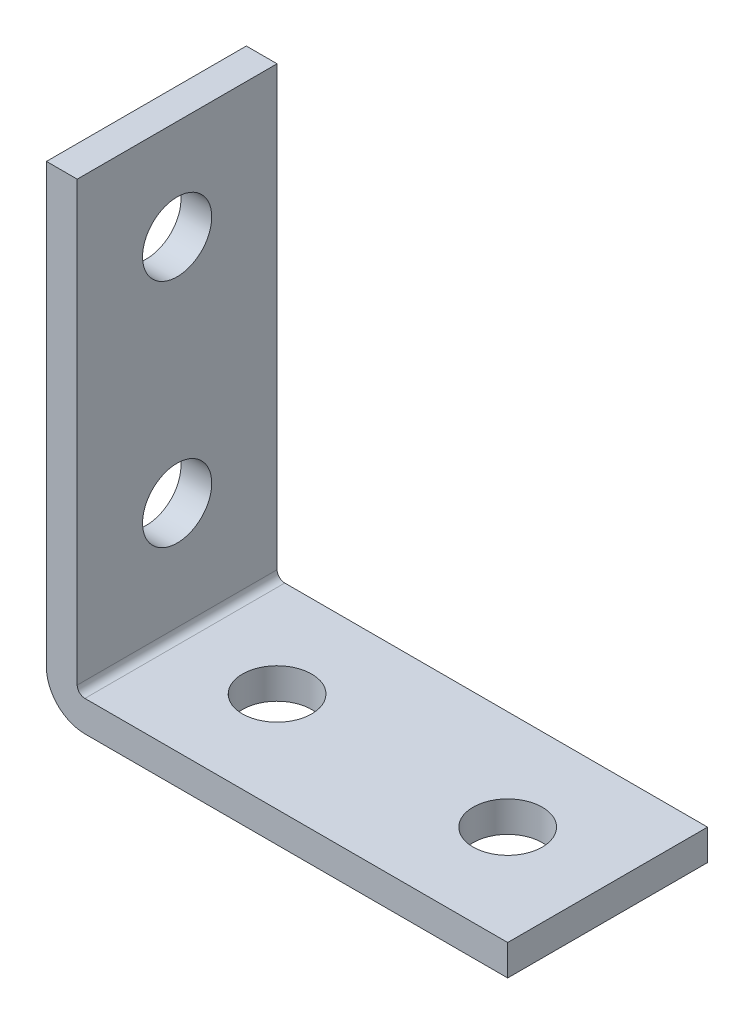
ISO-10303-21;
HEADER;
FILE_DESCRIPTION(('STEP AP214'),'2;1');
FILE_NAME('part.step','',(''),(''),'','','');
FILE_SCHEMA(('AUTOMOTIVE_DESIGN { 1 0 10303 214 1 1 1 1 }'));
ENDSEC;
DATA;
#1=APPLICATION_CONTEXT('core data for automotive mechanical design processes');
#2=APPLICATION_PROTOCOL_DEFINITION('international standard','automotive_design',2000,#1);
#3=PRODUCT_CONTEXT('',#1,'mechanical');
#4=PRODUCT('Part','Part','',(#3));
#5=PRODUCT_RELATED_PRODUCT_CATEGORY('part','',(#4));
#6=PRODUCT_DEFINITION_FORMATION('','',#4);
#7=PRODUCT_DEFINITION_CONTEXT('part definition',#1,'design');
#8=PRODUCT_DEFINITION('design','',#6,#7);
#9=PRODUCT_DEFINITION_SHAPE('','',#8);
#10=(LENGTH_UNIT() NAMED_UNIT(*) SI_UNIT(.MILLI.,.METRE.));
#11=(NAMED_UNIT(*) PLANE_ANGLE_UNIT() SI_UNIT($,.RADIAN.));
#12=(NAMED_UNIT(*) SI_UNIT($,.STERADIAN.) SOLID_ANGLE_UNIT());
#13=UNCERTAINTY_MEASURE_WITH_UNIT(LENGTH_MEASURE(1.E-05),#10,'distance_accuracy_value','');
#14=(GEOMETRIC_REPRESENTATION_CONTEXT(3) GLOBAL_UNCERTAINTY_ASSIGNED_CONTEXT((#13)) GLOBAL_UNIT_ASSIGNED_CONTEXT((#10,
#11,#12)) REPRESENTATION_CONTEXT('',''));
#15=CARTESIAN_POINT('',(0.,0.,0.));
#16=DIRECTION('',(0.,0.,1.));
#17=DIRECTION('',(1.,0.,0.));
#18=AXIS2_PLACEMENT_3D('',#15,#16,#17);
#19=CARTESIAN_POINT('',(7.93750000000001,0.,20.6375));
#20=DIRECTION('',(0.,1.,0.));
#21=DIRECTION('',(0.,0.,1.));
#22=AXIS2_PLACEMENT_3D('',#19,#20,#21);
#23=PLANE('',#22);
#24=CARTESIAN_POINT('',(26.9875,0.,0.));
#25=DIRECTION('',(0.,1.,0.));
#26=DIRECTION('',(0.,0.,1.));
#27=AXIS2_PLACEMENT_3D('',#24,#25,#26);
#28=CIRCLE('',#27,7.14375);
#29=CARTESIAN_POINT('',(26.9875,0.,7.14375));
#30=VERTEX_POINT('',#29);
#31=EDGE_CURVE('E180',#30,#30,#28,.T.);
#32=ORIENTED_EDGE('',*,*,#31,.T.);
#33=EDGE_LOOP('',(#32));
#34=FACE_BOUND('',#33,.T.);
#35=CARTESIAN_POINT('',(74.6125,0.,0.));
#36=DIRECTION('',(0.,1.,0.));
#37=DIRECTION('',(0.,0.,1.));
#38=AXIS2_PLACEMENT_3D('',#35,#36,#37);
#39=CIRCLE('',#38,7.14375);
#40=CARTESIAN_POINT('',(74.6125,0.,7.14375));
#41=VERTEX_POINT('',#40);
#42=EDGE_CURVE('E133',#41,#41,#39,.T.);
#43=ORIENTED_EDGE('',*,*,#42,.T.);
#44=EDGE_LOOP('',(#43));
#45=FACE_BOUND('',#44,.T.);
#46=DIRECTION('',(1.,0.,0.));
#47=VECTOR('',#46,1.);
#48=CARTESIAN_POINT('',(7.93750000000001,0.,-20.6375));
#49=LINE('',#48,#47);
#50=CARTESIAN_POINT('',(7.93750000000001,0.,-20.6375));
#51=VERTEX_POINT('',#50);
#52=CARTESIAN_POINT('',(95.25,0.,-20.6375));
#53=VERTEX_POINT('',#52);
#54=EDGE_CURVE('E129',#51,#53,#49,.T.);
#55=ORIENTED_EDGE('',*,*,#54,.T.);
#56=DIRECTION('',(0.,0.,-1.));
#57=VECTOR('',#56,1.);
#58=CARTESIAN_POINT('',(95.25,0.,20.6375));
#59=LINE('',#58,#57);
#60=CARTESIAN_POINT('',(95.25,0.,20.6375));
#61=VERTEX_POINT('',#60);
#62=EDGE_CURVE('E11',#61,#53,#59,.T.);
#63=ORIENTED_EDGE('',*,*,#62,.F.);
#64=DIRECTION('',(1.,0.,0.));
#65=VECTOR('',#64,1.);
#66=CARTESIAN_POINT('',(7.93750000000001,0.,20.6375));
#67=LINE('',#66,#65);
#68=CARTESIAN_POINT('',(7.93750000000001,0.,20.6375));
#69=VERTEX_POINT('',#68);
#70=EDGE_CURVE('E87',#69,#61,#67,.T.);
#71=ORIENTED_EDGE('',*,*,#70,.F.);
#72=DIRECTION('',(0.,0.,-1.));
#73=VECTOR('',#72,1.);
#74=CARTESIAN_POINT('',(7.93750000000001,0.,20.6375));
#75=LINE('',#74,#73);
#76=EDGE_CURVE('E128',#69,#51,#75,.T.);
#77=ORIENTED_EDGE('',*,*,#76,.T.);
#78=EDGE_LOOP('',(#55,#63,#71,#77));
#79=FACE_BOUND('',#78,.T.);
#80=ADVANCED_FACE('F32',(#34,#45,#79),#23,.F.);
#81=CARTESIAN_POINT('',(95.25,6.35,20.6375));
#82=DIRECTION('',(1.,0.,0.));
#83=DIRECTION('',(0.,0.,-1.));
#84=AXIS2_PLACEMENT_3D('',#81,#82,#83);
#85=PLANE('',#84);
#86=DIRECTION('',(0.,-1.,0.));
#87=VECTOR('',#86,1.);
#88=CARTESIAN_POINT('',(95.25,6.35,-20.6375));
#89=LINE('',#88,#87);
#90=CARTESIAN_POINT('',(95.25,6.35,-20.6375));
#91=VERTEX_POINT('',#90);
#92=EDGE_CURVE('E132',#91,#53,#89,.T.);
#93=ORIENTED_EDGE('',*,*,#92,.F.);
#94=DIRECTION('',(0.,0.,-1.));
#95=VECTOR('',#94,1.);
#96=CARTESIAN_POINT('',(95.25,6.35,20.6375));
#97=LINE('',#96,#95);
#98=CARTESIAN_POINT('',(95.25,6.35,20.6375));
#99=VERTEX_POINT('',#98);
#100=EDGE_CURVE('E40',#99,#91,#97,.T.);
#101=ORIENTED_EDGE('',*,*,#100,.F.);
#102=DIRECTION('',(0.,-1.,0.));
#103=VECTOR('',#102,1.);
#104=CARTESIAN_POINT('',(95.25,6.35,20.6375));
#105=LINE('',#104,#103);
#106=EDGE_CURVE('E172',#99,#61,#105,.T.);
#107=ORIENTED_EDGE('',*,*,#106,.T.);
#108=ORIENTED_EDGE('',*,*,#62,.T.);
#109=EDGE_LOOP('',(#93,#101,#107,#108));
#110=FACE_BOUND('',#109,.T.);
#111=ADVANCED_FACE('F163',(#110),#85,.T.);
#112=CARTESIAN_POINT('',(7.93750000000001,6.35,20.6375));
#113=DIRECTION('',(0.,1.,0.));
#114=DIRECTION('',(0.,0.,1.));
#115=AXIS2_PLACEMENT_3D('',#112,#113,#114);
#116=PLANE('',#115);
#117=CARTESIAN_POINT('',(26.9875,6.35,0.));
#118=DIRECTION('',(0.,1.,0.));
#119=DIRECTION('',(0.,0.,1.));
#120=AXIS2_PLACEMENT_3D('',#117,#118,#119);
#121=CIRCLE('',#120,7.14375);
#122=CARTESIAN_POINT('',(26.9875,6.35,7.14375));
#123=VERTEX_POINT('',#122);
#124=EDGE_CURVE('E183',#123,#123,#121,.T.);
#125=ORIENTED_EDGE('',*,*,#124,.F.);
#126=EDGE_LOOP('',(#125));
#127=FACE_BOUND('',#126,.T.);
#128=CARTESIAN_POINT('',(74.6125,6.35,0.));
#129=DIRECTION('',(0.,1.,0.));
#130=DIRECTION('',(0.,0.,1.));
#131=AXIS2_PLACEMENT_3D('',#128,#129,#130);
#132=CIRCLE('',#131,7.14375);
#133=CARTESIAN_POINT('',(74.6125,6.35,7.14375));
#134=VERTEX_POINT('',#133);
#135=EDGE_CURVE('E177',#134,#134,#132,.T.);
#136=ORIENTED_EDGE('',*,*,#135,.F.);
#137=EDGE_LOOP('',(#136));
#138=FACE_BOUND('',#137,.T.);
#139=DIRECTION('',(1.,0.,0.));
#140=VECTOR('',#139,1.);
#141=CARTESIAN_POINT('',(7.93750000000001,6.35,-20.6375));
#142=LINE('',#141,#140);
#143=CARTESIAN_POINT('',(7.93750000000001,6.35,-20.6375));
#144=VERTEX_POINT('',#143);
#145=EDGE_CURVE('E136',#144,#91,#142,.T.);
#146=ORIENTED_EDGE('',*,*,#145,.F.);
#147=DIRECTION('',(0.,0.,-1.));
#148=VECTOR('',#147,1.);
#149=CARTESIAN_POINT('',(7.93750000000001,6.35,20.6375));
#150=LINE('',#149,#148);
#151=CARTESIAN_POINT('',(7.93750000000001,6.35,20.6375));
#152=VERTEX_POINT('',#151);
#153=EDGE_CURVE('E153',#152,#144,#150,.T.);
#154=ORIENTED_EDGE('',*,*,#153,.F.);
#155=DIRECTION('',(1.,0.,0.));
#156=VECTOR('',#155,1.);
#157=CARTESIAN_POINT('',(7.93750000000001,6.35,20.6375));
#158=LINE('',#157,#156);
#159=EDGE_CURVE('E160',#152,#99,#158,.T.);
#160=ORIENTED_EDGE('',*,*,#159,.T.);
#161=ORIENTED_EDGE('',*,*,#100,.T.);
#162=EDGE_LOOP('',(#146,#154,#160,#161));
#163=FACE_BOUND('',#162,.T.);
#164=ADVANCED_FACE('F158',(#127,#138,#163),#116,.T.);
#165=CARTESIAN_POINT('',(7.93750000000001,7.9375,20.6375));
#166=DIRECTION('',(0.,0.,-1.));
#167=DIRECTION('',(-1.,0.,0.));
#168=AXIS2_PLACEMENT_3D('',#165,#166,#167);
#169=CYLINDRICAL_SURFACE('',#168,1.5875);
#170=CARTESIAN_POINT('',(7.93750000000001,7.9375,-20.6375));
#171=DIRECTION('',(0.,0.,1.));
#172=DIRECTION('',(1.,0.,0.));
#173=AXIS2_PLACEMENT_3D('',#170,#171,#172);
#174=CIRCLE('',#173,1.5875);
#175=CARTESIAN_POINT('',(6.35000000000001,7.9375,-20.6375));
#176=VERTEX_POINT('',#175);
#177=EDGE_CURVE('E139',#176,#144,#174,.T.);
#178=ORIENTED_EDGE('',*,*,#177,.F.);
#179=DIRECTION('',(0.,0.,-1.));
#180=VECTOR('',#179,1.);
#181=CARTESIAN_POINT('',(6.35000000000001,7.9375,20.6375));
#182=LINE('',#181,#180);
#183=CARTESIAN_POINT('',(6.35000000000001,7.9375,20.6375));
#184=VERTEX_POINT('',#183);
#185=EDGE_CURVE('E151',#184,#176,#182,.T.);
#186=ORIENTED_EDGE('',*,*,#185,.F.);
#187=CARTESIAN_POINT('',(7.93750000000001,7.9375,20.6375));
#188=DIRECTION('',(0.,0.,1.));
#189=DIRECTION('',(1.,0.,0.));
#190=AXIS2_PLACEMENT_3D('',#187,#188,#189);
#191=CIRCLE('',#190,1.5875);
#192=EDGE_CURVE('E123',#184,#152,#191,.T.);
#193=ORIENTED_EDGE('',*,*,#192,.T.);
#194=ORIENTED_EDGE('',*,*,#153,.T.);
#195=EDGE_LOOP('',(#178,#186,#193,#194));
#196=FACE_BOUND('',#195,.T.);
#197=ADVANCED_FACE('F170',(#196),#169,.F.);
#198=CARTESIAN_POINT('',(6.35,98.425,20.6375));
#199=DIRECTION('',(1.,0.,0.));
#200=DIRECTION('',(0.,1.,0.));
#201=AXIS2_PLACEMENT_3D('',#198,#199,#200);
#202=PLANE('',#201);
#203=CARTESIAN_POINT('',(6.35000000000001,30.1625,0.));
#204=DIRECTION('',(1.,0.,0.));
#205=DIRECTION('',(0.,1.,0.));
#206=AXIS2_PLACEMENT_3D('',#203,#204,#205);
#207=CIRCLE('',#206,7.14375);
#208=CARTESIAN_POINT('',(6.35000000000001,37.30625,0.));
#209=VERTEX_POINT('',#208);
#210=EDGE_CURVE('E195',#209,#209,#207,.T.);
#211=ORIENTED_EDGE('',*,*,#210,.F.);
#212=EDGE_LOOP('',(#211));
#213=FACE_BOUND('',#212,.T.);
#214=CARTESIAN_POINT('',(6.35,77.7875,0.));
#215=DIRECTION('',(1.,0.,0.));
#216=DIRECTION('',(0.,1.,0.));
#217=AXIS2_PLACEMENT_3D('',#214,#215,#216);
#218=CIRCLE('',#217,7.14375000000001);
#219=CARTESIAN_POINT('',(6.35,84.93125,0.));
#220=VERTEX_POINT('',#219);
#221=EDGE_CURVE('E189',#220,#220,#218,.T.);
#222=ORIENTED_EDGE('',*,*,#221,.F.);
#223=EDGE_LOOP('',(#222));
#224=FACE_BOUND('',#223,.T.);
#225=DIRECTION('',(0.,-1.,0.));
#226=VECTOR('',#225,1.);
#227=CARTESIAN_POINT('',(6.35,98.425,-20.6375));
#228=LINE('',#227,#226);
#229=CARTESIAN_POINT('',(6.35,98.425,-20.6375));
#230=VERTEX_POINT('',#229);
#231=EDGE_CURVE('E142',#230,#176,#228,.T.);
#232=ORIENTED_EDGE('',*,*,#231,.F.);
#233=DIRECTION('',(0.,0.,-1.));
#234=VECTOR('',#233,1.);
#235=CARTESIAN_POINT('',(6.35,98.425,20.6375));
#236=LINE('',#235,#234);
#237=CARTESIAN_POINT('',(6.35,98.425,20.6375));
#238=VERTEX_POINT('',#237);
#239=EDGE_CURVE('E111',#238,#230,#236,.T.);
#240=ORIENTED_EDGE('',*,*,#239,.F.);
#241=DIRECTION('',(0.,-1.,0.));
#242=VECTOR('',#241,1.);
#243=CARTESIAN_POINT('',(6.35,98.425,20.6375));
#244=LINE('',#243,#242);
#245=EDGE_CURVE('E121',#238,#184,#244,.T.);
#246=ORIENTED_EDGE('',*,*,#245,.T.);
#247=ORIENTED_EDGE('',*,*,#185,.T.);
#248=EDGE_LOOP('',(#232,#240,#246,#247));
#249=FACE_BOUND('',#248,.T.);
#250=ADVANCED_FACE('F210',(#213,#224,#249),#202,.T.);
#251=CARTESIAN_POINT('',(0.,98.425,20.6375));
#252=DIRECTION('',(0.,1.,0.));
#253=DIRECTION('',(0.,0.,1.));
#254=AXIS2_PLACEMENT_3D('',#251,#252,#253);
#255=PLANE('',#254);
#256=DIRECTION('',(1.,0.,0.));
#257=VECTOR('',#256,1.);
#258=CARTESIAN_POINT('',(0.,98.425,-20.6375));
#259=LINE('',#258,#257);
#260=CARTESIAN_POINT('',(0.,98.425,-20.6375));
#261=VERTEX_POINT('',#260);
#262=EDGE_CURVE('E110',#261,#230,#259,.T.);
#263=ORIENTED_EDGE('',*,*,#262,.F.);
#264=DIRECTION('',(0.,0.,-1.));
#265=VECTOR('',#264,1.);
#266=CARTESIAN_POINT('',(0.,98.425,20.6375));
#267=LINE('',#266,#265);
#268=CARTESIAN_POINT('',(0.,98.425,20.6375));
#269=VERTEX_POINT('',#268);
#270=EDGE_CURVE('E104',#269,#261,#267,.T.);
#271=ORIENTED_EDGE('',*,*,#270,.F.);
#272=DIRECTION('',(1.,0.,0.));
#273=VECTOR('',#272,1.);
#274=CARTESIAN_POINT('',(0.,98.425,20.6375));
#275=LINE('',#274,#273);
#276=EDGE_CURVE('E108',#269,#238,#275,.T.);
#277=ORIENTED_EDGE('',*,*,#276,.T.);
#278=ORIENTED_EDGE('',*,*,#239,.T.);
#279=EDGE_LOOP('',(#263,#271,#277,#278));
#280=FACE_BOUND('',#279,.T.);
#281=ADVANCED_FACE('F106',(#280),#255,.T.);
#282=CARTESIAN_POINT('',(0.,98.425,20.6375));
#283=DIRECTION('',(1.,0.,0.));
#284=DIRECTION('',(0.,1.,0.));
#285=AXIS2_PLACEMENT_3D('',#282,#283,#284);
#286=PLANE('',#285);
#287=CARTESIAN_POINT('',(0.,30.1625,0.));
#288=DIRECTION('',(1.,0.,0.));
#289=DIRECTION('',(0.,1.,0.));
#290=AXIS2_PLACEMENT_3D('',#287,#288,#289);
#291=CIRCLE('',#290,7.14375);
#292=CARTESIAN_POINT('',(0.,37.30625,0.));
#293=VERTEX_POINT('',#292);
#294=EDGE_CURVE('E192',#293,#293,#291,.T.);
#295=ORIENTED_EDGE('',*,*,#294,.T.);
#296=EDGE_LOOP('',(#295));
#297=FACE_BOUND('',#296,.T.);
#298=CARTESIAN_POINT('',(0.,77.7875,0.));
#299=DIRECTION('',(1.,0.,0.));
#300=DIRECTION('',(0.,1.,0.));
#301=AXIS2_PLACEMENT_3D('',#298,#299,#300);
#302=CIRCLE('',#301,7.14375000000001);
#303=CARTESIAN_POINT('',(0.,84.93125,0.));
#304=VERTEX_POINT('',#303);
#305=EDGE_CURVE('E186',#304,#304,#302,.T.);
#306=ORIENTED_EDGE('',*,*,#305,.T.);
#307=EDGE_LOOP('',(#306));
#308=FACE_BOUND('',#307,.T.);
#309=DIRECTION('',(0.,-1.,0.));
#310=VECTOR('',#309,1.);
#311=CARTESIAN_POINT('',(0.,98.425,-20.6375));
#312=LINE('',#311,#310);
#313=CARTESIAN_POINT('',(0.,7.9375,-20.6375));
#314=VERTEX_POINT('',#313);
#315=EDGE_CURVE('E75',#261,#314,#312,.T.);
#316=ORIENTED_EDGE('',*,*,#315,.T.);
#317=DIRECTION('',(0.,0.,-1.));
#318=VECTOR('',#317,1.);
#319=CARTESIAN_POINT('',(0.,7.9375,20.6375));
#320=LINE('',#319,#318);
#321=CARTESIAN_POINT('',(0.,7.9375,20.6375));
#322=VERTEX_POINT('',#321);
#323=EDGE_CURVE('E112',#322,#314,#320,.T.);
#324=ORIENTED_EDGE('',*,*,#323,.F.);
#325=DIRECTION('',(0.,-1.,0.));
#326=VECTOR('',#325,1.);
#327=CARTESIAN_POINT('',(0.,98.425,20.6375));
#328=LINE('',#327,#326);
#329=EDGE_CURVE('E114',#269,#322,#328,.T.);
#330=ORIENTED_EDGE('',*,*,#329,.F.);
#331=ORIENTED_EDGE('',*,*,#270,.T.);
#332=EDGE_LOOP('',(#316,#324,#330,#331));
#333=FACE_BOUND('',#332,.T.);
#334=ADVANCED_FACE('F115',(#297,#308,#333),#286,.F.);
#335=CARTESIAN_POINT('',(7.93750000000001,7.9375,20.6375));
#336=DIRECTION('',(0.,0.,-1.));
#337=DIRECTION('',(-1.,0.,0.));
#338=AXIS2_PLACEMENT_3D('',#335,#336,#337);
#339=CYLINDRICAL_SURFACE('',#338,7.9375);
#340=CARTESIAN_POINT('',(7.93750000000001,7.9375,-20.6375));
#341=DIRECTION('',(0.,0.,1.));
#342=DIRECTION('',(1.,0.,0.));
#343=AXIS2_PLACEMENT_3D('',#340,#341,#342);
#344=CIRCLE('',#343,7.9375);
#345=EDGE_CURVE('E81',#314,#51,#344,.T.);
#346=ORIENTED_EDGE('',*,*,#345,.T.);
#347=ORIENTED_EDGE('',*,*,#76,.F.);
#348=CARTESIAN_POINT('',(7.93750000000001,7.9375,20.6375));
#349=DIRECTION('',(0.,0.,1.));
#350=DIRECTION('',(1.,0.,0.));
#351=AXIS2_PLACEMENT_3D('',#348,#349,#350);
#352=CIRCLE('',#351,7.9375);
#353=EDGE_CURVE('E48',#322,#69,#352,.T.);
#354=ORIENTED_EDGE('',*,*,#353,.F.);
#355=ORIENTED_EDGE('',*,*,#323,.T.);
#356=EDGE_LOOP('',(#346,#347,#354,#355));
#357=FACE_BOUND('',#356,.T.);
#358=ADVANCED_FACE('F217',(#357),#339,.T.);
#359=CARTESIAN_POINT('',(7.93750000000001,7.9375,20.6375));
#360=DIRECTION('',(0.,0.,1.));
#361=DIRECTION('',(1.,0.,0.));
#362=AXIS2_PLACEMENT_3D('',#359,#360,#361);
#363=PLANE('',#362);
#364=ORIENTED_EDGE('',*,*,#70,.T.);
#365=ORIENTED_EDGE('',*,*,#106,.F.);
#366=ORIENTED_EDGE('',*,*,#159,.F.);
#367=ORIENTED_EDGE('',*,*,#192,.F.);
#368=ORIENTED_EDGE('',*,*,#245,.F.);
#369=ORIENTED_EDGE('',*,*,#276,.F.);
#370=ORIENTED_EDGE('',*,*,#329,.T.);
#371=ORIENTED_EDGE('',*,*,#353,.T.);
#372=EDGE_LOOP('',(#364,#365,#366,#367,#368,#369,#370,#371));
#373=FACE_BOUND('',#372,.T.);
#374=ADVANCED_FACE('F118',(#373),#363,.T.);
#375=CARTESIAN_POINT('',(7.93750000000001,7.9375,-20.6375));
#376=DIRECTION('',(0.,0.,1.));
#377=DIRECTION('',(1.,0.,0.));
#378=AXIS2_PLACEMENT_3D('',#375,#376,#377);
#379=PLANE('',#378);
#380=ORIENTED_EDGE('',*,*,#54,.F.);
#381=ORIENTED_EDGE('',*,*,#345,.F.);
#382=ORIENTED_EDGE('',*,*,#315,.F.);
#383=ORIENTED_EDGE('',*,*,#262,.T.);
#384=ORIENTED_EDGE('',*,*,#231,.T.);
#385=ORIENTED_EDGE('',*,*,#177,.T.);
#386=ORIENTED_EDGE('',*,*,#145,.T.);
#387=ORIENTED_EDGE('',*,*,#92,.T.);
#388=EDGE_LOOP('',(#380,#381,#382,#383,#384,#385,#386,#387));
#389=FACE_BOUND('',#388,.T.);
#390=ADVANCED_FACE('F166',(#389),#379,.F.);
#391=CARTESIAN_POINT('',(74.6125,0.,0.));
#392=DIRECTION('',(0.,1.,0.));
#393=DIRECTION('',(0.,0.,1.));
#394=AXIS2_PLACEMENT_3D('',#391,#392,#393);
#395=CYLINDRICAL_SURFACE('',#394,7.14375);
#396=ORIENTED_EDGE('',*,*,#42,.F.);
#397=EDGE_LOOP('',(#396));
#398=FACE_BOUND('',#397,.T.);
#399=ORIENTED_EDGE('',*,*,#135,.T.);
#400=EDGE_LOOP('',(#399));
#401=FACE_BOUND('',#400,.T.);
#402=ADVANCED_FACE('F236',(#398,#401),#395,.F.);
#403=CARTESIAN_POINT('',(26.9875,0.,0.));
#404=DIRECTION('',(0.,1.,0.));
#405=DIRECTION('',(0.,0.,1.));
#406=AXIS2_PLACEMENT_3D('',#403,#404,#405);
#407=CYLINDRICAL_SURFACE('',#406,7.14375);
#408=ORIENTED_EDGE('',*,*,#31,.F.);
#409=EDGE_LOOP('',(#408));
#410=FACE_BOUND('',#409,.T.);
#411=ORIENTED_EDGE('',*,*,#124,.T.);
#412=EDGE_LOOP('',(#411));
#413=FACE_BOUND('',#412,.T.);
#414=ADVANCED_FACE('F239',(#410,#413),#407,.F.);
#415=CARTESIAN_POINT('',(0.,77.7875,0.));
#416=DIRECTION('',(1.,0.,0.));
#417=DIRECTION('',(0.,1.,0.));
#418=AXIS2_PLACEMENT_3D('',#415,#416,#417);
#419=CYLINDRICAL_SURFACE('',#418,7.14375000000001);
#420=CARTESIAN_POINT('',(0.,84.93125,0.));
#421=CARTESIAN_POINT('',(0.0661458333333238,84.93125,0.));
#422=CARTESIAN_POINT('',(0.132291666666657,84.93125,0.));
#423=CARTESIAN_POINT('',(0.264583333333324,84.93125,0.));
#424=CARTESIAN_POINT('',(0.330729166666658,84.93125,0.));
#425=CARTESIAN_POINT('',(0.463020833333325,84.93125,0.));
#426=CARTESIAN_POINT('',(0.529166666666658,84.93125,0.));
#427=CARTESIAN_POINT('',(0.661458333333325,84.93125,0.));
#428=CARTESIAN_POINT('',(0.727604166666658,84.93125,0.));
#429=CARTESIAN_POINT('',(0.859895833333325,84.93125,0.));
#430=CARTESIAN_POINT('',(0.926041666666659,84.93125,0.));
#431=CARTESIAN_POINT('',(1.05833333333333,84.93125,0.));
#432=CARTESIAN_POINT('',(1.12447916666666,84.93125,0.));
#433=CARTESIAN_POINT('',(1.25677083333333,84.93125,0.));
#434=CARTESIAN_POINT('',(1.32291666666666,84.93125,0.));
#435=CARTESIAN_POINT('',(1.45520833333333,84.93125,0.));
#436=CARTESIAN_POINT('',(1.52135416666666,84.93125,0.));
#437=CARTESIAN_POINT('',(1.65364583333333,84.93125,0.));
#438=CARTESIAN_POINT('',(1.71979166666666,84.93125,0.));
#439=CARTESIAN_POINT('',(1.85208333333333,84.93125,0.));
#440=CARTESIAN_POINT('',(1.91822916666666,84.93125,0.));
#441=CARTESIAN_POINT('',(2.05052083333333,84.93125,0.));
#442=CARTESIAN_POINT('',(2.11666666666666,84.93125,0.));
#443=CARTESIAN_POINT('',(2.24895833333333,84.93125,0.));
#444=CARTESIAN_POINT('',(2.31510416666666,84.93125,0.));
#445=CARTESIAN_POINT('',(2.44739583333333,84.93125,0.));
#446=CARTESIAN_POINT('',(2.51354166666666,84.93125,0.));
#447=CARTESIAN_POINT('',(2.64583333333333,84.93125,0.));
#448=CARTESIAN_POINT('',(2.71197916666666,84.93125,0.));
#449=CARTESIAN_POINT('',(2.84427083333333,84.93125,0.));
#450=CARTESIAN_POINT('',(2.91041666666666,84.93125,0.));
#451=CARTESIAN_POINT('',(3.04270833333333,84.93125,0.));
#452=CARTESIAN_POINT('',(3.10885416666666,84.93125,0.));
#453=CARTESIAN_POINT('',(3.24114583333333,84.93125,0.));
#454=CARTESIAN_POINT('',(3.30729166666666,84.93125,0.));
#455=CARTESIAN_POINT('',(3.43958333333333,84.93125,0.));
#456=CARTESIAN_POINT('',(3.50572916666666,84.93125,0.));
#457=CARTESIAN_POINT('',(3.63802083333333,84.93125,0.));
#458=CARTESIAN_POINT('',(3.70416666666666,84.93125,0.));
#459=CARTESIAN_POINT('',(3.83645833333333,84.93125,0.));
#460=CARTESIAN_POINT('',(3.90260416666666,84.93125,0.));
#461=CARTESIAN_POINT('',(4.03489583333333,84.93125,0.));
#462=CARTESIAN_POINT('',(4.10104166666666,84.93125,0.));
#463=CARTESIAN_POINT('',(4.23333333333333,84.93125,0.));
#464=CARTESIAN_POINT('',(4.29947916666666,84.93125,0.));
#465=CARTESIAN_POINT('',(4.43177083333333,84.93125,0.));
#466=CARTESIAN_POINT('',(4.49791666666667,84.93125,0.));
#467=CARTESIAN_POINT('',(4.63020833333333,84.93125,0.));
#468=CARTESIAN_POINT('',(4.69635416666666,84.93125,0.));
#469=CARTESIAN_POINT('',(4.82864583333333,84.93125,0.));
#470=CARTESIAN_POINT('',(4.89479166666667,84.93125,0.));
#471=CARTESIAN_POINT('',(5.02708333333333,84.93125,0.));
#472=CARTESIAN_POINT('',(5.09322916666667,84.93125,0.));
#473=CARTESIAN_POINT('',(5.22552083333333,84.93125,0.));
#474=CARTESIAN_POINT('',(5.29166666666667,84.93125,0.));
#475=CARTESIAN_POINT('',(5.42395833333333,84.93125,0.));
#476=CARTESIAN_POINT('',(5.49010416666667,84.93125,0.));
#477=CARTESIAN_POINT('',(5.62239583333333,84.93125,0.));
#478=CARTESIAN_POINT('',(5.68854166666667,84.93125,0.));
#479=CARTESIAN_POINT('',(5.82083333333333,84.93125,0.));
#480=CARTESIAN_POINT('',(5.88697916666667,84.93125,0.));
#481=CARTESIAN_POINT('',(6.01927083333333,84.93125,0.));
#482=CARTESIAN_POINT('',(6.08541666666667,84.93125,0.));
#483=CARTESIAN_POINT('',(6.21770833333333,84.93125,0.));
#484=CARTESIAN_POINT('',(6.28385416666667,84.93125,0.));
#485=CARTESIAN_POINT('',(6.35,84.93125,0.));
#486=B_SPLINE_CURVE_WITH_KNOTS('',3,(#420,#421,#422,#423,#424,#425,#426,#427,#428,#429,#430,
#431,#432,#433,#434,#435,#436,#437,#438,#439,#440,#441,#442,#443,#444,#445,#446,#447,#448,#449,
#450,#451,#452,#453,#454,#455,#456,#457,#458,#459,#460,#461,#462,#463,#464,#465,#466,#467,#468,
#469,#470,#471,#472,#473,#474,#475,#476,#477,#478,#479,#480,#481,#482,#483,#484,#485),
.UNSPECIFIED.,.F.,.F.,(4,2,2,2,2,2,2,2,2,2,2,2,2,2,2,2,2,2,2,2,2,2,2,2,2,2,2,2,2,2,2,2,4),(0.,
0.1984375,0.396875000000001,0.595312500000001,0.793750000000001,0.992187500000002,1.190625,
1.3890625,1.5875,1.7859375,1.984375,2.1828125,2.38125,2.5796875,2.77812500000001,
2.97656250000001,3.17500000000001,3.37343750000001,3.57187500000001,3.77031250000001,
3.96875000000001,4.16718750000001,4.36562500000001,4.56406250000001,4.76250000000001,
4.96093750000001,5.15937500000001,5.35781250000001,5.55625000000001,5.75468750000001,
5.95312500000001,6.15156250000001,6.35000000000001),.UNSPECIFIED.);
#487=EDGE_CURVE('BSEAM206',#304,#220,#486,.T.);
#488=ORIENTED_EDGE('',*,*,#305,.F.);
#489=ORIENTED_EDGE('',*,*,#221,.T.);
#490=ORIENTED_EDGE('',*,*,#487,.T.);
#491=ORIENTED_EDGE('',*,*,#487,.F.);
#492=EDGE_LOOP('',(#488,#490,#489,#491));
#493=FACE_BOUND('',#492,.T.);
#494=ADVANCED_FACE('F206',(#493),#419,.F.);
#495=CARTESIAN_POINT('',(0.,30.1625,0.));
#496=DIRECTION('',(1.,0.,0.));
#497=DIRECTION('',(0.,1.,0.));
#498=AXIS2_PLACEMENT_3D('',#495,#496,#497);
#499=CYLINDRICAL_SURFACE('',#498,7.14375);
#500=CARTESIAN_POINT('',(0.,37.30625,0.));
#501=CARTESIAN_POINT('',(0.0661458333333299,37.30625,0.));
#502=CARTESIAN_POINT('',(0.132291666666663,37.30625,0.));
#503=CARTESIAN_POINT('',(0.26458333333333,37.30625,0.));
#504=CARTESIAN_POINT('',(0.330729166666664,37.30625,0.));
#505=CARTESIAN_POINT('',(0.463020833333331,37.30625,0.));
#506=CARTESIAN_POINT('',(0.529166666666664,37.30625,0.));
#507=CARTESIAN_POINT('',(0.661458333333331,37.30625,0.));
#508=CARTESIAN_POINT('',(0.727604166666664,37.30625,0.));
#509=CARTESIAN_POINT('',(0.859895833333331,37.30625,0.));
#510=CARTESIAN_POINT('',(0.926041666666665,37.30625,0.));
#511=CARTESIAN_POINT('',(1.05833333333333,37.30625,0.));
#512=CARTESIAN_POINT('',(1.12447916666667,37.30625,0.));
#513=CARTESIAN_POINT('',(1.25677083333333,37.30625,0.));
#514=CARTESIAN_POINT('',(1.32291666666667,37.30625,0.));
#515=CARTESIAN_POINT('',(1.45520833333333,37.30625,0.));
#516=CARTESIAN_POINT('',(1.52135416666667,37.30625,0.));
#517=CARTESIAN_POINT('',(1.65364583333333,37.30625,0.));
#518=CARTESIAN_POINT('',(1.71979166666667,37.30625,0.));
#519=CARTESIAN_POINT('',(1.85208333333333,37.30625,0.));
#520=CARTESIAN_POINT('',(1.91822916666667,37.30625,0.));
#521=CARTESIAN_POINT('',(2.05052083333333,37.30625,0.));
#522=CARTESIAN_POINT('',(2.11666666666667,37.30625,0.));
#523=CARTESIAN_POINT('',(2.24895833333333,37.30625,0.));
#524=CARTESIAN_POINT('',(2.31510416666667,37.30625,0.));
#525=CARTESIAN_POINT('',(2.44739583333333,37.30625,0.));
#526=CARTESIAN_POINT('',(2.51354166666667,37.30625,0.));
#527=CARTESIAN_POINT('',(2.64583333333333,37.30625,0.));
#528=CARTESIAN_POINT('',(2.71197916666667,37.30625,0.));
#529=CARTESIAN_POINT('',(2.84427083333334,37.30625,0.));
#530=CARTESIAN_POINT('',(2.91041666666667,37.30625,0.));
#531=CARTESIAN_POINT('',(3.04270833333334,37.30625,0.));
#532=CARTESIAN_POINT('',(3.10885416666667,37.30625,0.));
#533=CARTESIAN_POINT('',(3.24114583333334,37.30625,0.));
#534=CARTESIAN_POINT('',(3.30729166666667,37.30625,0.));
#535=CARTESIAN_POINT('',(3.43958333333334,37.30625,0.));
#536=CARTESIAN_POINT('',(3.50572916666667,37.30625,0.));
#537=CARTESIAN_POINT('',(3.63802083333334,37.30625,0.));
#538=CARTESIAN_POINT('',(3.70416666666667,37.30625,0.));
#539=CARTESIAN_POINT('',(3.83645833333334,37.30625,0.));
#540=CARTESIAN_POINT('',(3.90260416666667,37.30625,0.));
#541=CARTESIAN_POINT('',(4.03489583333334,37.30625,0.));
#542=CARTESIAN_POINT('',(4.10104166666667,37.30625,0.));
#543=CARTESIAN_POINT('',(4.23333333333334,37.30625,0.));
#544=CARTESIAN_POINT('',(4.29947916666667,37.30625,0.));
#545=CARTESIAN_POINT('',(4.43177083333334,37.30625,0.));
#546=CARTESIAN_POINT('',(4.49791666666667,37.30625,0.));
#547=CARTESIAN_POINT('',(4.63020833333334,37.30625,0.));
#548=CARTESIAN_POINT('',(4.69635416666667,37.30625,0.));
#549=CARTESIAN_POINT('',(4.82864583333334,37.30625,0.));
#550=CARTESIAN_POINT('',(4.89479166666667,37.30625,0.));
#551=CARTESIAN_POINT('',(5.02708333333334,37.30625,0.));
#552=CARTESIAN_POINT('',(5.09322916666667,37.30625,0.));
#553=CARTESIAN_POINT('',(5.22552083333334,37.30625,0.));
#554=CARTESIAN_POINT('',(5.29166666666667,37.30625,0.));
#555=CARTESIAN_POINT('',(5.42395833333334,37.30625,0.));
#556=CARTESIAN_POINT('',(5.49010416666667,37.30625,0.));
#557=CARTESIAN_POINT('',(5.62239583333334,37.30625,0.));
#558=CARTESIAN_POINT('',(5.68854166666667,37.30625,0.));
#559=CARTESIAN_POINT('',(5.82083333333334,37.30625,0.));
#560=CARTESIAN_POINT('',(5.88697916666667,37.30625,0.));
#561=CARTESIAN_POINT('',(6.01927083333334,37.30625,0.));
#562=CARTESIAN_POINT('',(6.08541666666667,37.30625,0.));
#563=CARTESIAN_POINT('',(6.21770833333334,37.30625,0.));
#564=CARTESIAN_POINT('',(6.28385416666667,37.30625,0.));
#565=CARTESIAN_POINT('',(6.35000000000001,37.30625,0.));
#566=B_SPLINE_CURVE_WITH_KNOTS('',3,(#500,#501,#502,#503,#504,#505,#506,#507,#508,#509,#510,
#511,#512,#513,#514,#515,#516,#517,#518,#519,#520,#521,#522,#523,#524,#525,#526,#527,#528,#529,
#530,#531,#532,#533,#534,#535,#536,#537,#538,#539,#540,#541,#542,#543,#544,#545,#546,#547,#548,
#549,#550,#551,#552,#553,#554,#555,#556,#557,#558,#559,#560,#561,#562,#563,#564,#565),
.UNSPECIFIED.,.F.,.F.,(4,2,2,2,2,2,2,2,2,2,2,2,2,2,2,2,2,2,2,2,2,2,2,2,2,2,2,2,2,2,2,2,4),(0.,
0.1984375,0.396875000000001,0.595312500000001,0.793750000000001,0.992187500000002,1.190625,
1.3890625,1.5875,1.7859375,1.984375,2.1828125,2.38125,2.5796875,2.77812500000001,
2.97656250000001,3.17500000000001,3.37343750000001,3.57187500000001,3.77031250000001,
3.96875000000001,4.16718750000001,4.36562500000001,4.56406250000001,4.76250000000001,
4.96093750000001,5.15937500000001,5.35781250000001,5.55625000000001,5.75468750000001,
5.95312500000001,6.15156250000001,6.35000000000001),.UNSPECIFIED.);
#567=EDGE_CURVE('BSEAM203',#293,#209,#566,.T.);
#568=ORIENTED_EDGE('',*,*,#294,.F.);
#569=ORIENTED_EDGE('',*,*,#210,.T.);
#570=ORIENTED_EDGE('',*,*,#567,.T.);
#571=ORIENTED_EDGE('',*,*,#567,.F.);
#572=EDGE_LOOP('',(#568,#570,#569,#571));
#573=FACE_BOUND('',#572,.T.);
#574=ADVANCED_FACE('F203',(#573),#499,.F.);
#575=CLOSED_SHELL('',(#80,#111,#164,#197,#250,#281,#334,#358,#374,#390,#402,#414,#494,#574));
#576=MANIFOLD_SOLID_BREP('B2',#575);
#577=ADVANCED_BREP_SHAPE_REPRESENTATION('',(#18,#576),#14);
#578=SHAPE_DEFINITION_REPRESENTATION(#9,#577);
ENDSEC;
END-ISO-10303-21;
